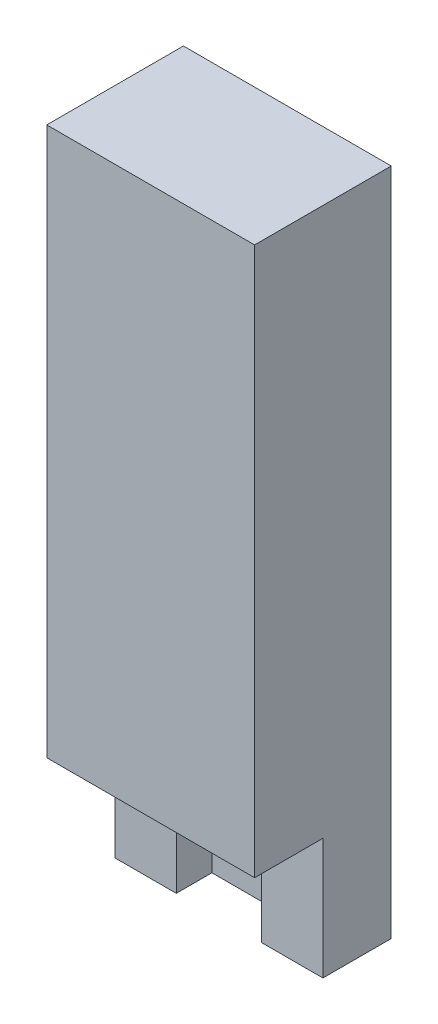
ISO-10303-21;
HEADER;
FILE_DESCRIPTION(('STEP AP214'),'2;1');
FILE_NAME('part.step','',(''),(''),'','','');
FILE_SCHEMA(('AUTOMOTIVE_DESIGN { 1 0 10303 214 1 1 1 1 }'));
ENDSEC;
DATA;
#1=APPLICATION_CONTEXT('core data for automotive mechanical design processes');
#2=APPLICATION_PROTOCOL_DEFINITION('international standard','automotive_design',2000,#1);
#3=PRODUCT_CONTEXT('',#1,'mechanical');
#4=PRODUCT('Part','Part','',(#3));
#5=PRODUCT_RELATED_PRODUCT_CATEGORY('part','',(#4));
#6=PRODUCT_DEFINITION_FORMATION('','',#4);
#7=PRODUCT_DEFINITION_CONTEXT('part definition',#1,'design');
#8=PRODUCT_DEFINITION('design','',#6,#7);
#9=PRODUCT_DEFINITION_SHAPE('','',#8);
#10=(LENGTH_UNIT() NAMED_UNIT(*) SI_UNIT(.MILLI.,.METRE.));
#11=(NAMED_UNIT(*) PLANE_ANGLE_UNIT() SI_UNIT($,.RADIAN.));
#12=(NAMED_UNIT(*) SI_UNIT($,.STERADIAN.) SOLID_ANGLE_UNIT());
#13=UNCERTAINTY_MEASURE_WITH_UNIT(LENGTH_MEASURE(1.E-05),#10,'distance_accuracy_value','');
#14=(GEOMETRIC_REPRESENTATION_CONTEXT(3) GLOBAL_UNCERTAINTY_ASSIGNED_CONTEXT((#13)) GLOBAL_UNIT_ASSIGNED_CONTEXT((#10,
#11,#12)) REPRESENTATION_CONTEXT('',''));
#15=CARTESIAN_POINT('',(0.,0.,0.));
#16=DIRECTION('',(0.,0.,1.));
#17=DIRECTION('',(1.,0.,0.));
#18=AXIS2_PLACEMENT_3D('',#15,#16,#17);
#19=CARTESIAN_POINT('',(0.,0.,4.8));
#20=DIRECTION('',(0.,0.,-1.));
#21=DIRECTION('',(-1.,0.,0.));
#22=AXIS2_PLACEMENT_3D('',#19,#20,#21);
#23=PLANE('',#22);
#24=DIRECTION('',(1.,0.,0.));
#25=VECTOR('',#24,1.);
#26=CARTESIAN_POINT('',(-7.3,-8.5,4.8));
#27=LINE('',#26,#25);
#28=CARTESIAN_POINT('',(-7.3,-8.5,4.8));
#29=VERTEX_POINT('',#28);
#30=CARTESIAN_POINT('',(-3.,-8.5,4.8));
#31=VERTEX_POINT('',#30);
#32=EDGE_CURVE('E153',#29,#31,#27,.T.);
#33=ORIENTED_EDGE('',*,*,#32,.T.);
#34=DIRECTION('',(0.,-1.,0.));
#35=VECTOR('',#34,1.);
#36=CARTESIAN_POINT('',(-3.,-8.5,4.8));
#37=LINE('',#36,#35);
#38=CARTESIAN_POINT('',(-3.,0.,4.8));
#39=VERTEX_POINT('',#38);
#40=EDGE_CURVE('E121',#39,#31,#37,.T.);
#41=ORIENTED_EDGE('',*,*,#40,.F.);
#42=DIRECTION('',(-1.,0.,0.));
#43=VECTOR('',#42,1.);
#44=CARTESIAN_POINT('',(-7.3,0.,4.8));
#45=LINE('',#44,#43);
#46=CARTESIAN_POINT('',(-7.3,0.,4.8));
#47=VERTEX_POINT('',#46);
#48=EDGE_CURVE('E157',#39,#47,#45,.T.);
#49=ORIENTED_EDGE('',*,*,#48,.T.);
#50=DIRECTION('',(0.,-1.,0.));
#51=VECTOR('',#50,1.);
#52=CARTESIAN_POINT('',(-7.3,-8.5,4.8));
#53=LINE('',#52,#51);
#54=EDGE_CURVE('E150',#47,#29,#53,.T.);
#55=ORIENTED_EDGE('',*,*,#54,.T.);
#56=EDGE_LOOP('',(#33,#41,#49,#55));
#57=FACE_BOUND('',#56,.T.);
#58=ADVANCED_FACE('F35',(#57),#23,.F.);
#59=CARTESIAN_POINT('',(7.3,0.,9.6));
#60=DIRECTION('',(-1.,0.,0.));
#61=DIRECTION('',(0.,0.,1.));
#62=AXIS2_PLACEMENT_3D('',#59,#60,#61);
#63=PLANE('',#62);
#64=DIRECTION('',(0.,-1.,0.));
#65=VECTOR('',#64,1.);
#66=CARTESIAN_POINT('',(7.3,0.,9.6));
#67=LINE('',#66,#65);
#68=CARTESIAN_POINT('',(7.3,38.5,9.6));
#69=VERTEX_POINT('',#68);
#70=CARTESIAN_POINT('',(7.3,0.,9.6));
#71=VERTEX_POINT('',#70);
#72=EDGE_CURVE('E167',#69,#71,#67,.T.);
#73=ORIENTED_EDGE('',*,*,#72,.T.);
#74=DIRECTION('',(0.,0.,1.));
#75=VECTOR('',#74,1.);
#76=CARTESIAN_POINT('',(7.3,0.,4.8));
#77=LINE('',#76,#75);
#78=CARTESIAN_POINT('',(7.3,0.,4.8));
#79=VERTEX_POINT('',#78);
#80=EDGE_CURVE('E60',#79,#71,#77,.T.);
#81=ORIENTED_EDGE('',*,*,#80,.F.);
#82=DIRECTION('',(0.,1.,0.));
#83=VECTOR('',#82,1.);
#84=CARTESIAN_POINT('',(7.3,-8.5,4.8));
#85=LINE('',#84,#83);
#86=CARTESIAN_POINT('',(7.3,-8.5,4.8));
#87=VERTEX_POINT('',#86);
#88=EDGE_CURVE('E155',#87,#79,#85,.T.);
#89=ORIENTED_EDGE('',*,*,#88,.F.);
#90=DIRECTION('',(0.,0.,-1.));
#91=VECTOR('',#90,1.);
#92=CARTESIAN_POINT('',(7.3,-8.5,9.6));
#93=LINE('',#92,#91);
#94=CARTESIAN_POINT('',(7.3,-8.5,0.));
#95=VERTEX_POINT('',#94);
#96=EDGE_CURVE('E39',#87,#95,#93,.T.);
#97=ORIENTED_EDGE('',*,*,#96,.T.);
#98=DIRECTION('',(0.,1.,0.));
#99=VECTOR('',#98,1.);
#100=CARTESIAN_POINT('',(7.3,0.,0.));
#101=LINE('',#100,#99);
#102=CARTESIAN_POINT('',(7.3,38.5,0.));
#103=VERTEX_POINT('',#102);
#104=EDGE_CURVE('E171',#95,#103,#101,.T.);
#105=ORIENTED_EDGE('',*,*,#104,.T.);
#106=DIRECTION('',(0.,0.,-1.));
#107=VECTOR('',#106,1.);
#108=CARTESIAN_POINT('',(7.3,38.5,9.6));
#109=LINE('',#108,#107);
#110=EDGE_CURVE('E11',#69,#103,#109,.T.);
#111=ORIENTED_EDGE('',*,*,#110,.F.);
#112=EDGE_LOOP('',(#73,#81,#89,#97,#105,#111));
#113=FACE_BOUND('',#112,.T.);
#114=ADVANCED_FACE('F194',(#113),#63,.F.);
#115=CARTESIAN_POINT('',(-7.3,38.5,9.6));
#116=DIRECTION('',(0.,1.,0.));
#117=DIRECTION('',(0.,0.,1.));
#118=AXIS2_PLACEMENT_3D('',#115,#116,#117);
#119=PLANE('',#118);
#120=DIRECTION('',(1.,0.,0.));
#121=VECTOR('',#120,1.);
#122=CARTESIAN_POINT('',(-7.3,38.5,0.));
#123=LINE('',#122,#121);
#124=CARTESIAN_POINT('',(-7.3,38.5,0.));
#125=VERTEX_POINT('',#124);
#126=EDGE_CURVE('E182',#125,#103,#123,.T.);
#127=ORIENTED_EDGE('',*,*,#126,.F.);
#128=DIRECTION('',(0.,0.,-1.));
#129=VECTOR('',#128,1.);
#130=CARTESIAN_POINT('',(-7.3,38.5,9.6));
#131=LINE('',#130,#129);
#132=CARTESIAN_POINT('',(-7.3,38.5,9.6));
#133=VERTEX_POINT('',#132);
#134=EDGE_CURVE('E44',#133,#125,#131,.T.);
#135=ORIENTED_EDGE('',*,*,#134,.F.);
#136=DIRECTION('',(1.,0.,0.));
#137=VECTOR('',#136,1.);
#138=CARTESIAN_POINT('',(-7.3,38.5,9.6));
#139=LINE('',#138,#137);
#140=EDGE_CURVE('E174',#133,#69,#139,.T.);
#141=ORIENTED_EDGE('',*,*,#140,.T.);
#142=ORIENTED_EDGE('',*,*,#110,.T.);
#143=EDGE_LOOP('',(#127,#135,#141,#142));
#144=FACE_BOUND('',#143,.T.);
#145=ADVANCED_FACE('F202',(#144),#119,.T.);
#146=CARTESIAN_POINT('',(-7.3,0.,9.6));
#147=DIRECTION('',(-1.,0.,0.));
#148=DIRECTION('',(0.,0.,1.));
#149=AXIS2_PLACEMENT_3D('',#146,#147,#148);
#150=PLANE('',#149);
#151=DIRECTION('',(0.,0.,1.));
#152=VECTOR('',#151,1.);
#153=CARTESIAN_POINT('',(-7.3,0.,4.8));
#154=LINE('',#153,#152);
#155=CARTESIAN_POINT('',(-7.3,0.,9.6));
#156=VERTEX_POINT('',#155);
#157=EDGE_CURVE('E162',#47,#156,#154,.T.);
#158=ORIENTED_EDGE('',*,*,#157,.T.);
#159=DIRECTION('',(0.,-1.,0.));
#160=VECTOR('',#159,1.);
#161=CARTESIAN_POINT('',(-7.3,0.,9.6));
#162=LINE('',#161,#160);
#163=EDGE_CURVE('E170',#133,#156,#162,.T.);
#164=ORIENTED_EDGE('',*,*,#163,.F.);
#165=ORIENTED_EDGE('',*,*,#134,.T.);
#166=DIRECTION('',(0.,1.,0.));
#167=VECTOR('',#166,1.);
#168=CARTESIAN_POINT('',(-7.3,0.,0.));
#169=LINE('',#168,#167);
#170=CARTESIAN_POINT('',(-7.3,-8.5,0.));
#171=VERTEX_POINT('',#170);
#172=EDGE_CURVE('E179',#171,#125,#169,.T.);
#173=ORIENTED_EDGE('',*,*,#172,.F.);
#174=DIRECTION('',(0.,0.,-1.));
#175=VECTOR('',#174,1.);
#176=CARTESIAN_POINT('',(-7.3,-8.5,9.6));
#177=LINE('',#176,#175);
#178=EDGE_CURVE('E187',#29,#171,#177,.T.);
#179=ORIENTED_EDGE('',*,*,#178,.F.);
#180=ORIENTED_EDGE('',*,*,#54,.F.);
#181=EDGE_LOOP('',(#158,#164,#165,#173,#179,#180));
#182=FACE_BOUND('',#181,.T.);
#183=ADVANCED_FACE('F211',(#182),#150,.T.);
#184=CARTESIAN_POINT('',(-7.3,-8.5,9.6));
#185=DIRECTION('',(0.,1.,0.));
#186=DIRECTION('',(0.,0.,1.));
#187=AXIS2_PLACEMENT_3D('',#184,#185,#186);
#188=PLANE('',#187);
#189=DIRECTION('',(1.,0.,0.));
#190=VECTOR('',#189,1.);
#191=CARTESIAN_POINT('',(-3.,-8.5,2.3));
#192=LINE('',#191,#190);
#193=CARTESIAN_POINT('',(-3.,-8.5,2.3));
#194=VERTEX_POINT('',#193);
#195=CARTESIAN_POINT('',(3.,-8.5,2.3));
#196=VERTEX_POINT('',#195);
#197=EDGE_CURVE('E132',#194,#196,#192,.T.);
#198=ORIENTED_EDGE('',*,*,#197,.F.);
#199=DIRECTION('',(0.,0.,1.));
#200=VECTOR('',#199,1.);
#201=CARTESIAN_POINT('',(-3.,-8.5,2.3));
#202=LINE('',#201,#200);
#203=EDGE_CURVE('E115',#194,#31,#202,.T.);
#204=ORIENTED_EDGE('',*,*,#203,.T.);
#205=ORIENTED_EDGE('',*,*,#32,.F.);
#206=ORIENTED_EDGE('',*,*,#178,.T.);
#207=DIRECTION('',(1.,0.,0.));
#208=VECTOR('',#207,1.);
#209=CARTESIAN_POINT('',(-7.3,-8.5,0.));
#210=LINE('',#209,#208);
#211=EDGE_CURVE('E165',#171,#95,#210,.T.);
#212=ORIENTED_EDGE('',*,*,#211,.T.);
#213=ORIENTED_EDGE('',*,*,#96,.F.);
#214=CARTESIAN_POINT('',(3.,-8.5,4.8));
#215=VERTEX_POINT('',#214);
#216=EDGE_CURVE('E152',#215,#87,#27,.T.);
#217=ORIENTED_EDGE('',*,*,#216,.F.);
#218=DIRECTION('',(0.,0.,1.));
#219=VECTOR('',#218,1.);
#220=CARTESIAN_POINT('',(3.,-8.5,2.3));
#221=LINE('',#220,#219);
#222=EDGE_CURVE('E52',#196,#215,#221,.T.);
#223=ORIENTED_EDGE('',*,*,#222,.F.);
#224=EDGE_LOOP('',(#198,#204,#205,#206,#212,#213,#217,#223));
#225=FACE_BOUND('',#224,.T.);
#226=ADVANCED_FACE('F37',(#225),#188,.F.);
#227=CARTESIAN_POINT('',(0.,0.,9.6));
#228=DIRECTION('',(0.,0.,1.));
#229=DIRECTION('',(1.,0.,0.));
#230=AXIS2_PLACEMENT_3D('',#227,#228,#229);
#231=PLANE('',#230);
#232=DIRECTION('',(-1.,0.,0.));
#233=VECTOR('',#232,1.);
#234=CARTESIAN_POINT('',(-7.3,0.,9.6));
#235=LINE('',#234,#233);
#236=EDGE_CURVE('E146',#71,#156,#235,.T.);
#237=ORIENTED_EDGE('',*,*,#236,.F.);
#238=ORIENTED_EDGE('',*,*,#72,.F.);
#239=ORIENTED_EDGE('',*,*,#140,.F.);
#240=ORIENTED_EDGE('',*,*,#163,.T.);
#241=EDGE_LOOP('',(#237,#238,#239,#240));
#242=FACE_BOUND('',#241,.T.);
#243=ADVANCED_FACE('F205',(#242),#231,.T.);
#244=CARTESIAN_POINT('',(0.,0.,0.));
#245=DIRECTION('',(0.,0.,1.));
#246=DIRECTION('',(1.,0.,0.));
#247=AXIS2_PLACEMENT_3D('',#244,#245,#246);
#248=PLANE('',#247);
#249=ORIENTED_EDGE('',*,*,#104,.F.);
#250=ORIENTED_EDGE('',*,*,#211,.F.);
#251=ORIENTED_EDGE('',*,*,#172,.T.);
#252=ORIENTED_EDGE('',*,*,#126,.T.);
#253=EDGE_LOOP('',(#249,#250,#251,#252));
#254=FACE_BOUND('',#253,.T.);
#255=ADVANCED_FACE('F198',(#254),#248,.F.);
#256=CARTESIAN_POINT('',(-7.3,0.,4.8));
#257=DIRECTION('',(0.,1.,0.));
#258=DIRECTION('',(0.,0.,1.));
#259=AXIS2_PLACEMENT_3D('',#256,#257,#258);
#260=PLANE('',#259);
#261=ORIENTED_EDGE('',*,*,#236,.T.);
#262=ORIENTED_EDGE('',*,*,#157,.F.);
#263=ORIENTED_EDGE('',*,*,#48,.F.);
#264=DIRECTION('',(0.,0.,1.));
#265=VECTOR('',#264,1.);
#266=CARTESIAN_POINT('',(-3.,0.,2.3));
#267=LINE('',#266,#265);
#268=CARTESIAN_POINT('',(-3.,0.,2.3));
#269=VERTEX_POINT('',#268);
#270=EDGE_CURVE('E144',#269,#39,#267,.T.);
#271=ORIENTED_EDGE('',*,*,#270,.F.);
#272=DIRECTION('',(-1.,0.,0.));
#273=VECTOR('',#272,1.);
#274=CARTESIAN_POINT('',(-3.,0.,2.3));
#275=LINE('',#274,#273);
#276=CARTESIAN_POINT('',(3.,0.,2.3));
#277=VERTEX_POINT('',#276);
#278=EDGE_CURVE('E126',#277,#269,#275,.T.);
#279=ORIENTED_EDGE('',*,*,#278,.F.);
#280=DIRECTION('',(0.,0.,1.));
#281=VECTOR('',#280,1.);
#282=CARTESIAN_POINT('',(3.,0.,2.3));
#283=LINE('',#282,#281);
#284=CARTESIAN_POINT('',(3.,0.,4.8));
#285=VERTEX_POINT('',#284);
#286=EDGE_CURVE('E147',#277,#285,#283,.T.);
#287=ORIENTED_EDGE('',*,*,#286,.T.);
#288=EDGE_CURVE('E158',#79,#285,#45,.T.);
#289=ORIENTED_EDGE('',*,*,#288,.F.);
#290=ORIENTED_EDGE('',*,*,#80,.T.);
#291=EDGE_LOOP('',(#261,#262,#263,#271,#279,#287,#289,#290));
#292=FACE_BOUND('',#291,.T.);
#293=ADVANCED_FACE('F207',(#292),#260,.F.);
#294=ORIENTED_EDGE('',*,*,#288,.T.);
#295=DIRECTION('',(0.,1.,0.));
#296=VECTOR('',#295,1.);
#297=CARTESIAN_POINT('',(3.,-8.5,4.8));
#298=LINE('',#297,#296);
#299=EDGE_CURVE('E134',#215,#285,#298,.T.);
#300=ORIENTED_EDGE('',*,*,#299,.F.);
#301=ORIENTED_EDGE('',*,*,#216,.T.);
#302=ORIENTED_EDGE('',*,*,#88,.T.);
#303=EDGE_LOOP('',(#294,#300,#301,#302));
#304=FACE_BOUND('',#303,.T.);
#305=ADVANCED_FACE('F215',(#304),#23,.F.);
#306=CARTESIAN_POINT('',(-3.,-8.5,2.3));
#307=DIRECTION('',(-1.,0.,0.));
#308=DIRECTION('',(0.,0.,1.));
#309=AXIS2_PLACEMENT_3D('',#306,#307,#308);
#310=PLANE('',#309);
#311=ORIENTED_EDGE('',*,*,#40,.T.);
#312=ORIENTED_EDGE('',*,*,#203,.F.);
#313=DIRECTION('',(0.,-1.,0.));
#314=VECTOR('',#313,1.);
#315=CARTESIAN_POINT('',(-3.,-8.5,2.3));
#316=LINE('',#315,#314);
#317=EDGE_CURVE('E118',#269,#194,#316,.T.);
#318=ORIENTED_EDGE('',*,*,#317,.F.);
#319=ORIENTED_EDGE('',*,*,#270,.T.);
#320=EDGE_LOOP('',(#311,#312,#318,#319));
#321=FACE_BOUND('',#320,.T.);
#322=ADVANCED_FACE('F117',(#321),#310,.F.);
#323=CARTESIAN_POINT('',(3.,-8.5,2.3));
#324=DIRECTION('',(1.,0.,0.));
#325=DIRECTION('',(0.,1.,0.));
#326=AXIS2_PLACEMENT_3D('',#323,#324,#325);
#327=PLANE('',#326);
#328=ORIENTED_EDGE('',*,*,#299,.T.);
#329=ORIENTED_EDGE('',*,*,#286,.F.);
#330=DIRECTION('',(0.,1.,0.));
#331=VECTOR('',#330,1.);
#332=CARTESIAN_POINT('',(3.,-8.5,2.3));
#333=LINE('',#332,#331);
#334=EDGE_CURVE('E137',#196,#277,#333,.T.);
#335=ORIENTED_EDGE('',*,*,#334,.F.);
#336=ORIENTED_EDGE('',*,*,#222,.T.);
#337=EDGE_LOOP('',(#328,#329,#335,#336));
#338=FACE_BOUND('',#337,.T.);
#339=ADVANCED_FACE('F213',(#338),#327,.F.);
#340=CARTESIAN_POINT('',(0.,0.,2.3));
#341=DIRECTION('',(0.,0.,-1.));
#342=DIRECTION('',(-1.,0.,0.));
#343=AXIS2_PLACEMENT_3D('',#340,#341,#342);
#344=PLANE('',#343);
#345=ORIENTED_EDGE('',*,*,#317,.T.);
#346=ORIENTED_EDGE('',*,*,#197,.T.);
#347=ORIENTED_EDGE('',*,*,#334,.T.);
#348=ORIENTED_EDGE('',*,*,#278,.T.);
#349=EDGE_LOOP('',(#345,#346,#347,#348));
#350=FACE_BOUND('',#349,.T.);
#351=ADVANCED_FACE('F130',(#350),#344,.F.);
#352=CLOSED_SHELL('',(#58,#114,#145,#183,#226,#243,#255,#293,#305,#322,#339,#351));
#353=MANIFOLD_SOLID_BREP('B2',#352);
#354=ADVANCED_BREP_SHAPE_REPRESENTATION('',(#18,#353),#14);
#355=SHAPE_DEFINITION_REPRESENTATION(#9,#354);
ENDSEC;
END-ISO-10303-21;
